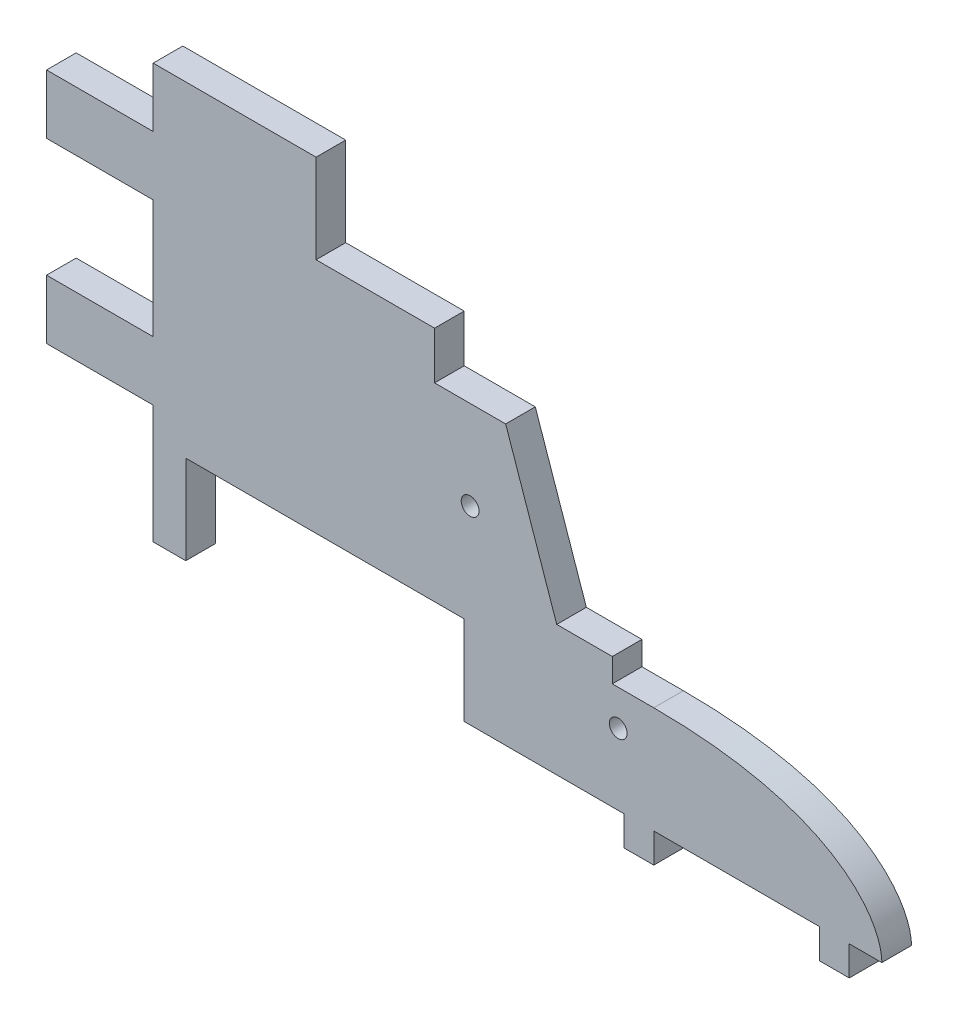
ISO-10303-21;
HEADER;
FILE_DESCRIPTION(('STEP AP214'),'2;1');
FILE_NAME('part.step','',(''),(''),'','','');
FILE_SCHEMA(('AUTOMOTIVE_DESIGN { 1 0 10303 214 1 1 1 1 }'));
ENDSEC;
DATA;
#1=APPLICATION_CONTEXT('core data for automotive mechanical design processes');
#2=APPLICATION_PROTOCOL_DEFINITION('international standard','automotive_design',2000,#1);
#3=PRODUCT_CONTEXT('',#1,'mechanical');
#4=PRODUCT('Part','Part','',(#3));
#5=PRODUCT_RELATED_PRODUCT_CATEGORY('part','',(#4));
#6=PRODUCT_DEFINITION_FORMATION('','',#4);
#7=PRODUCT_DEFINITION_CONTEXT('part definition',#1,'design');
#8=PRODUCT_DEFINITION('design','',#6,#7);
#9=PRODUCT_DEFINITION_SHAPE('','',#8);
#10=(LENGTH_UNIT() NAMED_UNIT(*) SI_UNIT(.MILLI.,.METRE.));
#11=(NAMED_UNIT(*) PLANE_ANGLE_UNIT() SI_UNIT($,.RADIAN.));
#12=(NAMED_UNIT(*) SI_UNIT($,.STERADIAN.) SOLID_ANGLE_UNIT());
#13=UNCERTAINTY_MEASURE_WITH_UNIT(LENGTH_MEASURE(1.E-05),#10,'distance_accuracy_value','');
#14=(GEOMETRIC_REPRESENTATION_CONTEXT(3) GLOBAL_UNCERTAINTY_ASSIGNED_CONTEXT((#13)) GLOBAL_UNIT_ASSIGNED_CONTEXT((#10,
#11,#12)) REPRESENTATION_CONTEXT('',''));
#15=CARTESIAN_POINT('',(0.,0.,0.));
#16=DIRECTION('',(0.,0.,1.));
#17=DIRECTION('',(1.,0.,0.));
#18=AXIS2_PLACEMENT_3D('',#15,#16,#17);
#19=CARTESIAN_POINT('',(0.,0.,5.));
#20=DIRECTION('',(0.,0.,-1.));
#21=DIRECTION('',(-1.,0.,0.));
#22=AXIS2_PLACEMENT_3D('',#19,#20,#21);
#23=PLANE('',#22);
#24=CARTESIAN_POINT('',(6.,32.,5.));
#25=DIRECTION('',(0.,0.,1.));
#26=DIRECTION('',(1.,0.,0.));
#27=AXIS2_PLACEMENT_3D('',#24,#25,#26);
#28=CIRCLE('',#27,1.5);
#29=CARTESIAN_POINT('',(7.5,32.,5.));
#30=VERTEX_POINT('',#29);
#31=EDGE_CURVE('E428',#30,#30,#28,.T.);
#32=ORIENTED_EDGE('',*,*,#31,.F.);
#33=EDGE_LOOP('',(#32));
#34=FACE_BOUND('',#33,.T.);
#35=DIRECTION('',(-1.,0.,0.));
#36=VECTOR('',#35,1.);
#37=CARTESIAN_POINT('',(0.,15.,5.));
#38=LINE('',#37,#36);
#39=CARTESIAN_POINT('',(5.,15.,5.));
#40=VERTEX_POINT('',#39);
#41=CARTESIAN_POINT('',(-42.,15.,5.));
#42=VERTEX_POINT('',#41);
#43=EDGE_CURVE('E304',#40,#42,#38,.T.);
#44=ORIENTED_EDGE('',*,*,#43,.F.);
#45=DIRECTION('',(0.,-1.,0.));
#46=VECTOR('',#45,1.);
#47=CARTESIAN_POINT('',(5.,0.,5.));
#48=LINE('',#47,#46);
#49=CARTESIAN_POINT('',(5.,0.,5.));
#50=VERTEX_POINT('',#49);
#51=EDGE_CURVE('E260',#40,#50,#48,.T.);
#52=ORIENTED_EDGE('',*,*,#51,.T.);
#53=DIRECTION('',(1.,0.,0.));
#54=VECTOR('',#53,1.);
#55=CARTESIAN_POINT('',(0.,0.,5.));
#56=LINE('',#55,#54);
#57=CARTESIAN_POINT('',(32.,0.,5.));
#58=VERTEX_POINT('',#57);
#59=EDGE_CURVE('E407',#50,#58,#56,.T.);
#60=ORIENTED_EDGE('',*,*,#59,.T.);
#61=DIRECTION('',(0.,-1.,0.));
#62=VECTOR('',#61,1.);
#63=CARTESIAN_POINT('',(32.,0.,5.));
#64=LINE('',#63,#62);
#65=CARTESIAN_POINT('',(32.,-5.,5.));
#66=VERTEX_POINT('',#65);
#67=EDGE_CURVE('E412',#58,#66,#64,.T.);
#68=ORIENTED_EDGE('',*,*,#67,.T.);
#69=DIRECTION('',(1.,0.,0.));
#70=VECTOR('',#69,1.);
#71=CARTESIAN_POINT('',(37.,-5.,5.));
#72=LINE('',#71,#70);
#73=CARTESIAN_POINT('',(37.,-5.,5.));
#74=VERTEX_POINT('',#73);
#75=EDGE_CURVE('E381',#66,#74,#72,.T.);
#76=ORIENTED_EDGE('',*,*,#75,.T.);
#77=DIRECTION('',(0.,1.,0.));
#78=VECTOR('',#77,1.);
#79=CARTESIAN_POINT('',(37.,0.,5.));
#80=LINE('',#79,#78);
#81=CARTESIAN_POINT('',(37.,0.,5.));
#82=VERTEX_POINT('',#81);
#83=EDGE_CURVE('E422',#74,#82,#80,.T.);
#84=ORIENTED_EDGE('',*,*,#83,.T.);
#85=DIRECTION('',(-1.,0.,0.));
#86=VECTOR('',#85,1.);
#87=CARTESIAN_POINT('',(37.,0.,5.));
#88=LINE('',#87,#86);
#89=CARTESIAN_POINT('',(65.,0.,5.));
#90=VERTEX_POINT('',#89);
#91=EDGE_CURVE('E443',#90,#82,#88,.T.);
#92=ORIENTED_EDGE('',*,*,#91,.F.);
#93=DIRECTION('',(0.,1.,0.));
#94=VECTOR('',#93,1.);
#95=CARTESIAN_POINT('',(65.,0.,5.));
#96=LINE('',#95,#94);
#97=CARTESIAN_POINT('',(65.,-4.99999999999995,5.));
#98=VERTEX_POINT('',#97);
#99=EDGE_CURVE('E475',#98,#90,#96,.T.);
#100=ORIENTED_EDGE('',*,*,#99,.F.);
#101=DIRECTION('',(-1.,0.,0.));
#102=VECTOR('',#101,1.);
#103=CARTESIAN_POINT('',(70.,-4.99999999999995,5.));
#104=LINE('',#103,#102);
#105=CARTESIAN_POINT('',(70.,-4.99999999999995,5.));
#106=VERTEX_POINT('',#105);
#107=EDGE_CURVE('E478',#106,#98,#104,.T.);
#108=ORIENTED_EDGE('',*,*,#107,.F.);
#109=DIRECTION('',(0.,-1.,0.));
#110=VECTOR('',#109,1.);
#111=CARTESIAN_POINT('',(70.,0.,5.));
#112=LINE('',#111,#110);
#113=CARTESIAN_POINT('',(70.,0.,5.));
#114=VERTEX_POINT('',#113);
#115=EDGE_CURVE('E480',#114,#106,#112,.T.);
#116=ORIENTED_EDGE('',*,*,#115,.F.);
#117=DIRECTION('',(-1.,0.,0.));
#118=VECTOR('',#117,1.);
#119=CARTESIAN_POINT('',(70.,0.,5.));
#120=LINE('',#119,#118);
#121=CARTESIAN_POINT('',(75.5,0.,5.));
#122=VERTEX_POINT('',#121);
#123=EDGE_CURVE('E313',#122,#114,#120,.T.);
#124=ORIENTED_EDGE('',*,*,#123,.F.);
#125=CARTESIAN_POINT('',(37.,18.,5.));
#126=CARTESIAN_POINT('',(67.6854096357002,18.,5.));
#127=CARTESIAN_POINT('',(75.5,5.98223252941199,5.));
#128=CARTESIAN_POINT('',(75.5,0.,5.));
#129=B_SPLINE_CURVE_WITH_KNOTS('',3,(#125,#126,#127,#128),.UNSPECIFIED.,.F.,.F.,(4,4),(0.,1.),.UNSPECIFIED.);
#130=CARTESIAN_POINT('',(37.,18.,5.));
#131=VERTEX_POINT('',#130);
#132=EDGE_CURVE('E307',#131,#122,#129,.T.);
#133=ORIENTED_EDGE('',*,*,#132,.F.);
#134=DIRECTION('',(-1.,0.,0.));
#135=VECTOR('',#134,1.);
#136=CARTESIAN_POINT('',(22.,18.,5.));
#137=LINE('',#136,#135);
#138=CARTESIAN_POINT('',(30.,18.,5.));
#139=VERTEX_POINT('',#138);
#140=EDGE_CURVE('E425',#131,#139,#137,.T.);
#141=ORIENTED_EDGE('',*,*,#140,.T.);
#142=DIRECTION('',(0.,-1.,0.));
#143=VECTOR('',#142,1.);
#144=CARTESIAN_POINT('',(30.,18.,5.));
#145=LINE('',#144,#143);
#146=CARTESIAN_POINT('',(30.,22.,5.));
#147=VERTEX_POINT('',#146);
#148=EDGE_CURVE('E271',#147,#139,#145,.T.);
#149=ORIENTED_EDGE('',*,*,#148,.F.);
#150=DIRECTION('',(1.,0.,0.));
#151=VECTOR('',#150,1.);
#152=CARTESIAN_POINT('',(30.,22.,5.));
#153=LINE('',#152,#151);
#154=CARTESIAN_POINT('',(20.6206896551724,22.,5.));
#155=VERTEX_POINT('',#154);
#156=EDGE_CURVE('E274',#155,#147,#153,.T.);
#157=ORIENTED_EDGE('',*,*,#156,.F.);
#158=DIRECTION('',(-0.325990683319404,0.945372981626272,0.));
#159=VECTOR('',#158,1.);
#160=CARTESIAN_POINT('',(12.,47.,5.));
#161=LINE('',#160,#159);
#162=CARTESIAN_POINT('',(12.,47.,5.));
#163=VERTEX_POINT('',#162);
#164=EDGE_CURVE('E427',#155,#163,#161,.T.);
#165=ORIENTED_EDGE('',*,*,#164,.T.);
#166=DIRECTION('',(-1.,0.,0.));
#167=VECTOR('',#166,1.);
#168=CARTESIAN_POINT('',(0.,47.,5.));
#169=LINE('',#168,#167);
#170=CARTESIAN_POINT('',(0.,47.,5.));
#171=VERTEX_POINT('',#170);
#172=EDGE_CURVE('E403',#163,#171,#169,.T.);
#173=ORIENTED_EDGE('',*,*,#172,.T.);
#174=DIRECTION('',(0.,-1.,0.));
#175=VECTOR('',#174,1.);
#176=CARTESIAN_POINT('',(0.,15.,5.));
#177=LINE('',#176,#175);
#178=CARTESIAN_POINT('',(0.,55.,5.));
#179=VERTEX_POINT('',#178);
#180=EDGE_CURVE('E296',#179,#171,#177,.T.);
#181=ORIENTED_EDGE('',*,*,#180,.F.);
#182=DIRECTION('',(1.,0.,0.));
#183=VECTOR('',#182,1.);
#184=CARTESIAN_POINT('',(0.,55.,5.));
#185=LINE('',#184,#183);
#186=CARTESIAN_POINT('',(-19.9999999999999,55.,5.));
#187=VERTEX_POINT('',#186);
#188=EDGE_CURVE('E292',#187,#179,#185,.T.);
#189=ORIENTED_EDGE('',*,*,#188,.F.);
#190=DIRECTION('',(0.,-1.,0.));
#191=VECTOR('',#190,1.);
#192=CARTESIAN_POINT('',(-19.9999999999999,55.,5.));
#193=LINE('',#192,#191);
#194=CARTESIAN_POINT('',(-19.9999999999999,70.,5.));
#195=VERTEX_POINT('',#194);
#196=EDGE_CURVE('E289',#195,#187,#193,.T.);
#197=ORIENTED_EDGE('',*,*,#196,.F.);
#198=DIRECTION('',(1.,0.,0.));
#199=VECTOR('',#198,1.);
#200=CARTESIAN_POINT('',(-19.9999999999999,70.,5.));
#201=LINE('',#200,#199);
#202=CARTESIAN_POINT('',(-47.5,70.,5.));
#203=VERTEX_POINT('',#202);
#204=EDGE_CURVE('E578',#203,#195,#201,.T.);
#205=ORIENTED_EDGE('',*,*,#204,.F.);
#206=DIRECTION('',(0.,1.,0.));
#207=VECTOR('',#206,1.);
#208=CARTESIAN_POINT('',(-47.5,70.,5.));
#209=LINE('',#208,#207);
#210=CARTESIAN_POINT('',(-47.5,60.,5.));
#211=VERTEX_POINT('',#210);
#212=EDGE_CURVE('E582',#211,#203,#209,.T.);
#213=ORIENTED_EDGE('',*,*,#212,.F.);
#214=DIRECTION('',(1.,0.,0.));
#215=VECTOR('',#214,1.);
#216=CARTESIAN_POINT('',(-47.5,60.,5.));
#217=LINE('',#216,#215);
#218=CARTESIAN_POINT('',(-65.5,60.,5.));
#219=VERTEX_POINT('',#218);
#220=EDGE_CURVE('E586',#219,#211,#217,.T.);
#221=ORIENTED_EDGE('',*,*,#220,.F.);
#222=DIRECTION('',(0.,1.,0.));
#223=VECTOR('',#222,1.);
#224=CARTESIAN_POINT('',(-65.5,60.,5.));
#225=LINE('',#224,#223);
#226=CARTESIAN_POINT('',(-65.5,50.,5.));
#227=VERTEX_POINT('',#226);
#228=EDGE_CURVE('E591',#227,#219,#225,.T.);
#229=ORIENTED_EDGE('',*,*,#228,.F.);
#230=DIRECTION('',(-1.,0.,0.));
#231=VECTOR('',#230,1.);
#232=CARTESIAN_POINT('',(-47.5,50.,5.));
#233=LINE('',#232,#231);
#234=CARTESIAN_POINT('',(-47.5,50.,5.));
#235=VERTEX_POINT('',#234);
#236=EDGE_CURVE('E594',#235,#227,#233,.T.);
#237=ORIENTED_EDGE('',*,*,#236,.F.);
#238=DIRECTION('',(0.,1.,0.));
#239=VECTOR('',#238,1.);
#240=CARTESIAN_POINT('',(-47.5,50.,5.));
#241=LINE('',#240,#239);
#242=CARTESIAN_POINT('',(-47.5,30.,5.));
#243=VERTEX_POINT('',#242);
#244=EDGE_CURVE('E597',#243,#235,#241,.T.);
#245=ORIENTED_EDGE('',*,*,#244,.F.);
#246=DIRECTION('',(1.,0.,0.));
#247=VECTOR('',#246,1.);
#248=CARTESIAN_POINT('',(-47.5,30.,5.));
#249=LINE('',#248,#247);
#250=CARTESIAN_POINT('',(-65.5,30.,5.));
#251=VERTEX_POINT('',#250);
#252=EDGE_CURVE('E600',#251,#243,#249,.T.);
#253=ORIENTED_EDGE('',*,*,#252,.F.);
#254=DIRECTION('',(0.,1.,0.));
#255=VECTOR('',#254,1.);
#256=CARTESIAN_POINT('',(-65.5,20.,5.));
#257=LINE('',#256,#255);
#258=CARTESIAN_POINT('',(-65.5,20.,5.));
#259=VERTEX_POINT('',#258);
#260=EDGE_CURVE('E603',#259,#251,#257,.T.);
#261=ORIENTED_EDGE('',*,*,#260,.F.);
#262=DIRECTION('',(-1.,0.,0.));
#263=VECTOR('',#262,1.);
#264=CARTESIAN_POINT('',(-47.5,20.,5.));
#265=LINE('',#264,#263);
#266=CARTESIAN_POINT('',(-47.5,20.,5.));
#267=VERTEX_POINT('',#266);
#268=EDGE_CURVE('E606',#267,#259,#265,.T.);
#269=ORIENTED_EDGE('',*,*,#268,.F.);
#270=DIRECTION('',(0.,1.,0.));
#271=VECTOR('',#270,1.);
#272=CARTESIAN_POINT('',(-47.5,20.,5.));
#273=LINE('',#272,#271);
#274=CARTESIAN_POINT('',(-47.5,0.,5.));
#275=VERTEX_POINT('',#274);
#276=EDGE_CURVE('E609',#275,#267,#273,.T.);
#277=ORIENTED_EDGE('',*,*,#276,.F.);
#278=DIRECTION('',(-1.,0.,0.));
#279=VECTOR('',#278,1.);
#280=CARTESIAN_POINT('',(-42.,0.,5.));
#281=LINE('',#280,#279);
#282=CARTESIAN_POINT('',(-42.,0.,5.));
#283=VERTEX_POINT('',#282);
#284=EDGE_CURVE('E611',#283,#275,#281,.T.);
#285=ORIENTED_EDGE('',*,*,#284,.F.);
#286=DIRECTION('',(0.,-1.,0.));
#287=VECTOR('',#286,1.);
#288=CARTESIAN_POINT('',(-42.,15.,5.));
#289=LINE('',#288,#287);
#290=EDGE_CURVE('E299',#42,#283,#289,.T.);
#291=ORIENTED_EDGE('',*,*,#290,.F.);
#292=EDGE_LOOP('',(#44,#52,#60,#68,#76,#84,#92,#100,#108,#116,#124,#133,#141,#149,#157,#165,
#173,#181,#189,#197,#205,#213,#221,#229,#237,#245,#253,#261,#269,#277,#285,#291));
#293=FACE_BOUND('',#292,.T.);
#294=CARTESIAN_POINT('',(31.,12.,5.));
#295=DIRECTION('',(0.,0.,1.));
#296=DIRECTION('',(1.,0.,0.));
#297=AXIS2_PLACEMENT_3D('',#294,#295,#296);
#298=CIRCLE('',#297,1.5);
#299=CARTESIAN_POINT('',(32.5,12.,5.));
#300=VERTEX_POINT('',#299);
#301=EDGE_CURVE('E432',#300,#300,#298,.T.);
#302=ORIENTED_EDGE('',*,*,#301,.F.);
#303=EDGE_LOOP('',(#302));
#304=FACE_BOUND('',#303,.T.);
#305=ADVANCED_FACE('F33',(#34,#293,#304),#23,.F.);
#306=CARTESIAN_POINT('',(0.,0.,0.));
#307=DIRECTION('',(0.,0.,-1.));
#308=DIRECTION('',(-1.,0.,0.));
#309=AXIS2_PLACEMENT_3D('',#306,#307,#308);
#310=PLANE('',#309);
#311=DIRECTION('',(0.,-1.,0.));
#312=VECTOR('',#311,1.);
#313=CARTESIAN_POINT('',(5.,15.,0.));
#314=LINE('',#313,#312);
#315=CARTESIAN_POINT('',(5.,15.,0.));
#316=VERTEX_POINT('',#315);
#317=CARTESIAN_POINT('',(5.,0.,0.));
#318=VERTEX_POINT('',#317);
#319=EDGE_CURVE('E258',#316,#318,#314,.T.);
#320=ORIENTED_EDGE('',*,*,#319,.F.);
#321=DIRECTION('',(-1.,0.,0.));
#322=VECTOR('',#321,1.);
#323=CARTESIAN_POINT('',(0.,15.,0.));
#324=LINE('',#323,#322);
#325=CARTESIAN_POINT('',(-42.,15.,0.));
#326=VERTEX_POINT('',#325);
#327=EDGE_CURVE('E242',#316,#326,#324,.T.);
#328=ORIENTED_EDGE('',*,*,#327,.T.);
#329=DIRECTION('',(0.,-1.,0.));
#330=VECTOR('',#329,1.);
#331=CARTESIAN_POINT('',(-42.,15.,0.));
#332=LINE('',#331,#330);
#333=CARTESIAN_POINT('',(-42.,0.,0.));
#334=VERTEX_POINT('',#333);
#335=EDGE_CURVE('E252',#326,#334,#332,.T.);
#336=ORIENTED_EDGE('',*,*,#335,.T.);
#337=DIRECTION('',(-1.,0.,0.));
#338=VECTOR('',#337,1.);
#339=CARTESIAN_POINT('',(-42.,0.,0.));
#340=LINE('',#339,#338);
#341=CARTESIAN_POINT('',(-47.5,0.,0.));
#342=VERTEX_POINT('',#341);
#343=EDGE_CURVE('E520',#334,#342,#340,.T.);
#344=ORIENTED_EDGE('',*,*,#343,.T.);
#345=DIRECTION('',(0.,1.,0.));
#346=VECTOR('',#345,1.);
#347=CARTESIAN_POINT('',(-47.5,20.,0.));
#348=LINE('',#347,#346);
#349=CARTESIAN_POINT('',(-47.5,20.,0.));
#350=VERTEX_POINT('',#349);
#351=EDGE_CURVE('E523',#342,#350,#348,.T.);
#352=ORIENTED_EDGE('',*,*,#351,.T.);
#353=DIRECTION('',(-1.,0.,0.));
#354=VECTOR('',#353,1.);
#355=CARTESIAN_POINT('',(-47.5,20.,0.));
#356=LINE('',#355,#354);
#357=CARTESIAN_POINT('',(-65.5,20.,0.));
#358=VERTEX_POINT('',#357);
#359=EDGE_CURVE('E526',#350,#358,#356,.T.);
#360=ORIENTED_EDGE('',*,*,#359,.T.);
#361=DIRECTION('',(0.,1.,0.));
#362=VECTOR('',#361,1.);
#363=CARTESIAN_POINT('',(-65.5,20.,0.));
#364=LINE('',#363,#362);
#365=CARTESIAN_POINT('',(-65.5,30.,0.));
#366=VERTEX_POINT('',#365);
#367=EDGE_CURVE('E529',#358,#366,#364,.T.);
#368=ORIENTED_EDGE('',*,*,#367,.T.);
#369=DIRECTION('',(1.,0.,0.));
#370=VECTOR('',#369,1.);
#371=CARTESIAN_POINT('',(-47.5,30.,0.));
#372=LINE('',#371,#370);
#373=CARTESIAN_POINT('',(-47.5,30.,0.));
#374=VERTEX_POINT('',#373);
#375=EDGE_CURVE('E532',#366,#374,#372,.T.);
#376=ORIENTED_EDGE('',*,*,#375,.T.);
#377=DIRECTION('',(0.,1.,0.));
#378=VECTOR('',#377,1.);
#379=CARTESIAN_POINT('',(-47.5,50.,0.));
#380=LINE('',#379,#378);
#381=CARTESIAN_POINT('',(-47.5,50.,0.));
#382=VERTEX_POINT('',#381);
#383=EDGE_CURVE('E535',#374,#382,#380,.T.);
#384=ORIENTED_EDGE('',*,*,#383,.T.);
#385=DIRECTION('',(-1.,0.,0.));
#386=VECTOR('',#385,1.);
#387=CARTESIAN_POINT('',(-47.5,50.,0.));
#388=LINE('',#387,#386);
#389=CARTESIAN_POINT('',(-65.5,50.,0.));
#390=VERTEX_POINT('',#389);
#391=EDGE_CURVE('E538',#382,#390,#388,.T.);
#392=ORIENTED_EDGE('',*,*,#391,.T.);
#393=DIRECTION('',(0.,1.,0.));
#394=VECTOR('',#393,1.);
#395=CARTESIAN_POINT('',(-65.5,60.,0.));
#396=LINE('',#395,#394);
#397=CARTESIAN_POINT('',(-65.5,60.,0.));
#398=VERTEX_POINT('',#397);
#399=EDGE_CURVE('E541',#390,#398,#396,.T.);
#400=ORIENTED_EDGE('',*,*,#399,.T.);
#401=DIRECTION('',(1.,0.,0.));
#402=VECTOR('',#401,1.);
#403=CARTESIAN_POINT('',(-47.5,60.,0.));
#404=LINE('',#403,#402);
#405=CARTESIAN_POINT('',(-47.5,60.,0.));
#406=VERTEX_POINT('',#405);
#407=EDGE_CURVE('E544',#398,#406,#404,.T.);
#408=ORIENTED_EDGE('',*,*,#407,.T.);
#409=DIRECTION('',(0.,1.,0.));
#410=VECTOR('',#409,1.);
#411=CARTESIAN_POINT('',(-47.5,70.,0.));
#412=LINE('',#411,#410);
#413=CARTESIAN_POINT('',(-47.5,70.,0.));
#414=VERTEX_POINT('',#413);
#415=EDGE_CURVE('E547',#406,#414,#412,.T.);
#416=ORIENTED_EDGE('',*,*,#415,.T.);
#417=DIRECTION('',(1.,0.,0.));
#418=VECTOR('',#417,1.);
#419=CARTESIAN_POINT('',(-19.9999999999999,70.,0.));
#420=LINE('',#419,#418);
#421=CARTESIAN_POINT('',(-19.9999999999999,70.,0.));
#422=VERTEX_POINT('',#421);
#423=EDGE_CURVE('E293',#414,#422,#420,.T.);
#424=ORIENTED_EDGE('',*,*,#423,.T.);
#425=DIRECTION('',(0.,-1.,0.));
#426=VECTOR('',#425,1.);
#427=CARTESIAN_POINT('',(-19.9999999999999,55.,0.));
#428=LINE('',#427,#426);
#429=CARTESIAN_POINT('',(-19.9999999999999,55.,0.));
#430=VERTEX_POINT('',#429);
#431=EDGE_CURVE('E284',#422,#430,#428,.T.);
#432=ORIENTED_EDGE('',*,*,#431,.T.);
#433=DIRECTION('',(1.,0.,0.));
#434=VECTOR('',#433,1.);
#435=CARTESIAN_POINT('',(0.,55.,0.));
#436=LINE('',#435,#434);
#437=CARTESIAN_POINT('',(0.,55.,0.));
#438=VERTEX_POINT('',#437);
#439=EDGE_CURVE('E513',#430,#438,#436,.T.);
#440=ORIENTED_EDGE('',*,*,#439,.T.);
#441=DIRECTION('',(0.,-1.,0.));
#442=VECTOR('',#441,1.);
#443=CARTESIAN_POINT('',(0.,15.,0.));
#444=LINE('',#443,#442);
#445=CARTESIAN_POINT('',(0.,47.,0.));
#446=VERTEX_POINT('',#445);
#447=EDGE_CURVE('E253',#438,#446,#444,.T.);
#448=ORIENTED_EDGE('',*,*,#447,.T.);
#449=DIRECTION('',(-1.,0.,0.));
#450=VECTOR('',#449,1.);
#451=CARTESIAN_POINT('',(0.,47.,0.));
#452=LINE('',#451,#450);
#453=CARTESIAN_POINT('',(12.,47.,0.));
#454=VERTEX_POINT('',#453);
#455=EDGE_CURVE('E394',#454,#446,#452,.T.);
#456=ORIENTED_EDGE('',*,*,#455,.F.);
#457=DIRECTION('',(-0.325990683319404,0.945372981626272,0.));
#458=VECTOR('',#457,1.);
#459=CARTESIAN_POINT('',(12.,47.,0.));
#460=LINE('',#459,#458);
#461=CARTESIAN_POINT('',(20.6206896551724,22.,0.));
#462=VERTEX_POINT('',#461);
#463=EDGE_CURVE('E392',#462,#454,#460,.T.);
#464=ORIENTED_EDGE('',*,*,#463,.F.);
#465=DIRECTION('',(1.,0.,0.));
#466=VECTOR('',#465,1.);
#467=CARTESIAN_POINT('',(30.,22.,0.));
#468=LINE('',#467,#466);
#469=CARTESIAN_POINT('',(30.,22.,0.));
#470=VERTEX_POINT('',#469);
#471=EDGE_CURVE('E275',#462,#470,#468,.T.);
#472=ORIENTED_EDGE('',*,*,#471,.T.);
#473=DIRECTION('',(0.,-1.,0.));
#474=VECTOR('',#473,1.);
#475=CARTESIAN_POINT('',(30.,18.,0.));
#476=LINE('',#475,#474);
#477=CARTESIAN_POINT('',(30.,18.,0.));
#478=VERTEX_POINT('',#477);
#479=EDGE_CURVE('E270',#470,#478,#476,.T.);
#480=ORIENTED_EDGE('',*,*,#479,.T.);
#481=DIRECTION('',(-1.,0.,0.));
#482=VECTOR('',#481,1.);
#483=CARTESIAN_POINT('',(22.,18.,0.));
#484=LINE('',#483,#482);
#485=CARTESIAN_POINT('',(37.,18.,0.));
#486=VERTEX_POINT('',#485);
#487=EDGE_CURVE('E53',#486,#478,#484,.T.);
#488=ORIENTED_EDGE('',*,*,#487,.F.);
#489=CARTESIAN_POINT('',(37.,18.,0.));
#490=CARTESIAN_POINT('',(67.6854096357002,18.,0.));
#491=CARTESIAN_POINT('',(75.5,5.98223252941199,0.));
#492=CARTESIAN_POINT('',(75.5,0.,0.));
#493=B_SPLINE_CURVE_WITH_KNOTS('',3,(#489,#490,#491,#492),.UNSPECIFIED.,.F.,.F.,(4,4),(0.,1.),.UNSPECIFIED.);
#494=CARTESIAN_POINT('',(75.5,0.,0.));
#495=VERTEX_POINT('',#494);
#496=EDGE_CURVE('E465',#486,#495,#493,.T.);
#497=ORIENTED_EDGE('',*,*,#496,.T.);
#498=DIRECTION('',(-1.,0.,0.));
#499=VECTOR('',#498,1.);
#500=CARTESIAN_POINT('',(70.,0.,0.));
#501=LINE('',#500,#499);
#502=CARTESIAN_POINT('',(70.,0.,0.));
#503=VERTEX_POINT('',#502);
#504=EDGE_CURVE('E462',#495,#503,#501,.T.);
#505=ORIENTED_EDGE('',*,*,#504,.T.);
#506=DIRECTION('',(0.,-1.,0.));
#507=VECTOR('',#506,1.);
#508=CARTESIAN_POINT('',(70.,0.,0.));
#509=LINE('',#508,#507);
#510=CARTESIAN_POINT('',(70.,-4.99999999999995,0.));
#511=VERTEX_POINT('',#510);
#512=EDGE_CURVE('E459',#503,#511,#509,.T.);
#513=ORIENTED_EDGE('',*,*,#512,.T.);
#514=DIRECTION('',(-1.,0.,0.));
#515=VECTOR('',#514,1.);
#516=CARTESIAN_POINT('',(70.,-4.99999999999995,0.));
#517=LINE('',#516,#515);
#518=CARTESIAN_POINT('',(65.,-4.99999999999995,0.));
#519=VERTEX_POINT('',#518);
#520=EDGE_CURVE('E456',#511,#519,#517,.T.);
#521=ORIENTED_EDGE('',*,*,#520,.T.);
#522=DIRECTION('',(0.,1.,0.));
#523=VECTOR('',#522,1.);
#524=CARTESIAN_POINT('',(65.,0.,0.));
#525=LINE('',#524,#523);
#526=CARTESIAN_POINT('',(65.,0.,0.));
#527=VERTEX_POINT('',#526);
#528=EDGE_CURVE('E453',#519,#527,#525,.T.);
#529=ORIENTED_EDGE('',*,*,#528,.T.);
#530=DIRECTION('',(-1.,0.,0.));
#531=VECTOR('',#530,1.);
#532=CARTESIAN_POINT('',(37.,0.,0.));
#533=LINE('',#532,#531);
#534=CARTESIAN_POINT('',(37.,0.,0.));
#535=VERTEX_POINT('',#534);
#536=EDGE_CURVE('E314',#527,#535,#533,.T.);
#537=ORIENTED_EDGE('',*,*,#536,.T.);
#538=DIRECTION('',(0.,1.,0.));
#539=VECTOR('',#538,1.);
#540=CARTESIAN_POINT('',(37.,0.,0.));
#541=LINE('',#540,#539);
#542=CARTESIAN_POINT('',(37.,-5.,0.));
#543=VERTEX_POINT('',#542);
#544=EDGE_CURVE('E386',#543,#535,#541,.T.);
#545=ORIENTED_EDGE('',*,*,#544,.F.);
#546=DIRECTION('',(1.,0.,0.));
#547=VECTOR('',#546,1.);
#548=CARTESIAN_POINT('',(37.,-5.,0.));
#549=LINE('',#548,#547);
#550=CARTESIAN_POINT('',(32.,-5.,0.));
#551=VERTEX_POINT('',#550);
#552=EDGE_CURVE('E376',#551,#543,#549,.T.);
#553=ORIENTED_EDGE('',*,*,#552,.F.);
#554=DIRECTION('',(0.,-1.,0.));
#555=VECTOR('',#554,1.);
#556=CARTESIAN_POINT('',(32.,0.,0.));
#557=LINE('',#556,#555);
#558=CARTESIAN_POINT('',(32.,0.,0.));
#559=VERTEX_POINT('',#558);
#560=EDGE_CURVE('E369',#559,#551,#557,.T.);
#561=ORIENTED_EDGE('',*,*,#560,.F.);
#562=DIRECTION('',(1.,0.,0.));
#563=VECTOR('',#562,1.);
#564=CARTESIAN_POINT('',(0.,0.,0.));
#565=LINE('',#564,#563);
#566=EDGE_CURVE('E266',#318,#559,#565,.T.);
#567=ORIENTED_EDGE('',*,*,#566,.F.);
#568=EDGE_LOOP('',(#320,#328,#336,#344,#352,#360,#368,#376,#384,#392,#400,#408,#416,#424,#432,
#440,#448,#456,#464,#472,#480,#488,#497,#505,#513,#521,#529,#537,#545,#553,#561,#567));
#569=FACE_BOUND('',#568,.T.);
#570=CARTESIAN_POINT('',(6.,32.,0.));
#571=DIRECTION('',(0.,0.,1.));
#572=DIRECTION('',(1.,0.,0.));
#573=AXIS2_PLACEMENT_3D('',#570,#571,#572);
#574=CIRCLE('',#573,1.5);
#575=CARTESIAN_POINT('',(7.5,32.,0.));
#576=VERTEX_POINT('',#575);
#577=EDGE_CURVE('E418',#576,#576,#574,.T.);
#578=ORIENTED_EDGE('',*,*,#577,.T.);
#579=EDGE_LOOP('',(#578));
#580=FACE_BOUND('',#579,.T.);
#581=CARTESIAN_POINT('',(31.,12.,0.));
#582=DIRECTION('',(0.,0.,1.));
#583=DIRECTION('',(1.,0.,0.));
#584=AXIS2_PLACEMENT_3D('',#581,#582,#583);
#585=CIRCLE('',#584,1.5);
#586=CARTESIAN_POINT('',(32.5,12.,0.));
#587=VERTEX_POINT('',#586);
#588=EDGE_CURVE('E434',#587,#587,#585,.T.);
#589=ORIENTED_EDGE('',*,*,#588,.T.);
#590=EDGE_LOOP('',(#589));
#591=FACE_BOUND('',#590,.T.);
#592=ADVANCED_FACE('F263',(#569,#580,#591),#310,.T.);
#593=CARTESIAN_POINT('',(0.,0.,5.));
#594=DIRECTION('',(0.,1.,0.));
#595=DIRECTION('',(-1.,0.,0.));
#596=AXIS2_PLACEMENT_3D('',#593,#594,#595);
#597=PLANE('',#596);
#598=ORIENTED_EDGE('',*,*,#59,.F.);
#599=DIRECTION('',(0.,0.,-1.));
#600=VECTOR('',#599,1.);
#601=CARTESIAN_POINT('',(5.,0.,5.));
#602=LINE('',#601,#600);
#603=EDGE_CURVE('E11',#50,#318,#602,.T.);
#604=ORIENTED_EDGE('',*,*,#603,.T.);
#605=ORIENTED_EDGE('',*,*,#566,.T.);
#606=DIRECTION('',(0.,0.,-1.));
#607=VECTOR('',#606,1.);
#608=CARTESIAN_POINT('',(32.,0.,5.));
#609=LINE('',#608,#607);
#610=EDGE_CURVE('E41',#58,#559,#609,.T.);
#611=ORIENTED_EDGE('',*,*,#610,.F.);
#612=EDGE_LOOP('',(#598,#604,#605,#611));
#613=FACE_BOUND('',#612,.T.);
#614=ADVANCED_FACE('F35',(#613),#597,.F.);
#615=CARTESIAN_POINT('',(32.,0.,5.));
#616=DIRECTION('',(1.,0.,0.));
#617=DIRECTION('',(0.,0.,-1.));
#618=AXIS2_PLACEMENT_3D('',#615,#616,#617);
#619=PLANE('',#618);
#620=ORIENTED_EDGE('',*,*,#560,.T.);
#621=DIRECTION('',(0.,0.,-1.));
#622=VECTOR('',#621,1.);
#623=CARTESIAN_POINT('',(32.,-5.,5.));
#624=LINE('',#623,#622);
#625=EDGE_CURVE('E372',#66,#551,#624,.T.);
#626=ORIENTED_EDGE('',*,*,#625,.F.);
#627=ORIENTED_EDGE('',*,*,#67,.F.);
#628=ORIENTED_EDGE('',*,*,#610,.T.);
#629=EDGE_LOOP('',(#620,#626,#627,#628));
#630=FACE_BOUND('',#629,.T.);
#631=ADVANCED_FACE('F359',(#630),#619,.F.);
#632=CARTESIAN_POINT('',(37.,-5.,5.));
#633=DIRECTION('',(0.,1.,0.));
#634=DIRECTION('',(-1.,0.,0.));
#635=AXIS2_PLACEMENT_3D('',#632,#633,#634);
#636=PLANE('',#635);
#637=ORIENTED_EDGE('',*,*,#552,.T.);
#638=DIRECTION('',(0.,0.,-1.));
#639=VECTOR('',#638,1.);
#640=CARTESIAN_POINT('',(37.,-5.,5.));
#641=LINE('',#640,#639);
#642=EDGE_CURVE('E382',#74,#543,#641,.T.);
#643=ORIENTED_EDGE('',*,*,#642,.F.);
#644=ORIENTED_EDGE('',*,*,#75,.F.);
#645=ORIENTED_EDGE('',*,*,#625,.T.);
#646=EDGE_LOOP('',(#637,#643,#644,#645));
#647=FACE_BOUND('',#646,.T.);
#648=ADVANCED_FACE('F356',(#647),#636,.F.);
#649=CARTESIAN_POINT('',(37.,0.,5.));
#650=DIRECTION('',(-1.,0.,0.));
#651=DIRECTION('',(0.,0.,1.));
#652=AXIS2_PLACEMENT_3D('',#649,#650,#651);
#653=PLANE('',#652);
#654=ORIENTED_EDGE('',*,*,#544,.T.);
#655=DIRECTION('',(0.,0.,-1.));
#656=VECTOR('',#655,1.);
#657=CARTESIAN_POINT('',(37.,0.,5.));
#658=LINE('',#657,#656);
#659=EDGE_CURVE('E437',#82,#535,#658,.T.);
#660=ORIENTED_EDGE('',*,*,#659,.F.);
#661=ORIENTED_EDGE('',*,*,#83,.F.);
#662=ORIENTED_EDGE('',*,*,#642,.T.);
#663=EDGE_LOOP('',(#654,#660,#661,#662));
#664=FACE_BOUND('',#663,.T.);
#665=ADVANCED_FACE('F353',(#664),#653,.F.);
#666=CARTESIAN_POINT('',(22.,18.,5.));
#667=DIRECTION('',(0.,-1.,0.));
#668=DIRECTION('',(1.,0.,0.));
#669=AXIS2_PLACEMENT_3D('',#666,#667,#668);
#670=PLANE('',#669);
#671=ORIENTED_EDGE('',*,*,#487,.T.);
#672=DIRECTION('',(0.,0.,-1.));
#673=VECTOR('',#672,1.);
#674=CARTESIAN_POINT('',(30.,18.,5.));
#675=LINE('',#674,#673);
#676=EDGE_CURVE('E48',#139,#478,#675,.T.);
#677=ORIENTED_EDGE('',*,*,#676,.F.);
#678=ORIENTED_EDGE('',*,*,#140,.F.);
#679=DIRECTION('',(0.,0.,-1.));
#680=VECTOR('',#679,1.);
#681=CARTESIAN_POINT('',(37.,18.,5.));
#682=LINE('',#681,#680);
#683=EDGE_CURVE('E492',#131,#486,#682,.T.);
#684=ORIENTED_EDGE('',*,*,#683,.T.);
#685=EDGE_LOOP('',(#671,#677,#678,#684));
#686=FACE_BOUND('',#685,.T.);
#687=ADVANCED_FACE('F349',(#686),#670,.F.);
#688=CARTESIAN_POINT('',(12.,47.,5.));
#689=DIRECTION('',(-0.945372981626272,-0.325990683319404,0.));
#690=DIRECTION('',(0.325990683319404,-0.945372981626272,0.));
#691=AXIS2_PLACEMENT_3D('',#688,#689,#690);
#692=PLANE('',#691);
#693=ORIENTED_EDGE('',*,*,#164,.F.);
#694=DIRECTION('',(0.,0.,-1.));
#695=VECTOR('',#694,1.);
#696=CARTESIAN_POINT('',(20.6206896551724,22.,5.));
#697=LINE('',#696,#695);
#698=EDGE_CURVE('E285',#155,#462,#697,.T.);
#699=ORIENTED_EDGE('',*,*,#698,.T.);
#700=ORIENTED_EDGE('',*,*,#463,.T.);
#701=DIRECTION('',(0.,0.,-1.));
#702=VECTOR('',#701,1.);
#703=CARTESIAN_POINT('',(12.,47.,5.));
#704=LINE('',#703,#702);
#705=EDGE_CURVE('E397',#163,#454,#704,.T.);
#706=ORIENTED_EDGE('',*,*,#705,.F.);
#707=EDGE_LOOP('',(#693,#699,#700,#706));
#708=FACE_BOUND('',#707,.T.);
#709=ADVANCED_FACE('F345',(#708),#692,.F.);
#710=CARTESIAN_POINT('',(0.,47.,5.));
#711=DIRECTION('',(0.,-1.,0.));
#712=DIRECTION('',(0.,0.,-1.));
#713=AXIS2_PLACEMENT_3D('',#710,#711,#712);
#714=PLANE('',#713);
#715=ORIENTED_EDGE('',*,*,#455,.T.);
#716=DIRECTION('',(0.,0.,-1.));
#717=VECTOR('',#716,1.);
#718=CARTESIAN_POINT('',(0.,47.,5.));
#719=LINE('',#718,#717);
#720=EDGE_CURVE('E400',#171,#446,#719,.T.);
#721=ORIENTED_EDGE('',*,*,#720,.F.);
#722=ORIENTED_EDGE('',*,*,#172,.F.);
#723=ORIENTED_EDGE('',*,*,#705,.T.);
#724=EDGE_LOOP('',(#715,#721,#722,#723));
#725=FACE_BOUND('',#724,.T.);
#726=ADVANCED_FACE('F336',(#725),#714,.F.);
#727=CARTESIAN_POINT('',(6.,32.,5.));
#728=DIRECTION('',(0.,0.,-1.));
#729=DIRECTION('',(-1.,0.,0.));
#730=AXIS2_PLACEMENT_3D('',#727,#728,#729);
#731=CYLINDRICAL_SURFACE('',#730,1.5);
#732=ORIENTED_EDGE('',*,*,#31,.T.);
#733=EDGE_LOOP('',(#732));
#734=FACE_BOUND('',#733,.T.);
#735=ORIENTED_EDGE('',*,*,#577,.F.);
#736=EDGE_LOOP('',(#735));
#737=FACE_BOUND('',#736,.T.);
#738=ADVANCED_FACE('F332',(#734,#737),#731,.F.);
#739=CARTESIAN_POINT('',(31.,12.,5.));
#740=DIRECTION('',(0.,0.,-1.));
#741=DIRECTION('',(-1.,0.,0.));
#742=AXIS2_PLACEMENT_3D('',#739,#740,#741);
#743=CYLINDRICAL_SURFACE('',#742,1.5);
#744=ORIENTED_EDGE('',*,*,#301,.T.);
#745=EDGE_LOOP('',(#744));
#746=FACE_BOUND('',#745,.T.);
#747=ORIENTED_EDGE('',*,*,#588,.F.);
#748=EDGE_LOOP('',(#747));
#749=FACE_BOUND('',#748,.T.);
#750=ADVANCED_FACE('F328',(#746,#749),#743,.F.);
#751=CARTESIAN_POINT('',(37.,0.,5.));
#752=DIRECTION('',(0.,-1.,0.));
#753=DIRECTION('',(1.,0.,0.));
#754=AXIS2_PLACEMENT_3D('',#751,#752,#753);
#755=PLANE('',#754);
#756=ORIENTED_EDGE('',*,*,#536,.F.);
#757=DIRECTION('',(0.,0.,-1.));
#758=VECTOR('',#757,1.);
#759=CARTESIAN_POINT('',(65.,0.,5.));
#760=LINE('',#759,#758);
#761=EDGE_CURVE('E449',#90,#527,#760,.T.);
#762=ORIENTED_EDGE('',*,*,#761,.F.);
#763=ORIENTED_EDGE('',*,*,#91,.T.);
#764=ORIENTED_EDGE('',*,*,#659,.T.);
#765=EDGE_LOOP('',(#756,#762,#763,#764));
#766=FACE_BOUND('',#765,.T.);
#767=ADVANCED_FACE('F331',(#766),#755,.T.);
#768=CARTESIAN_POINT('',(65.,0.,5.));
#769=DIRECTION('',(-1.,0.,0.));
#770=DIRECTION('',(0.,0.,1.));
#771=AXIS2_PLACEMENT_3D('',#768,#769,#770);
#772=PLANE('',#771);
#773=ORIENTED_EDGE('',*,*,#528,.F.);
#774=DIRECTION('',(0.,0.,-1.));
#775=VECTOR('',#774,1.);
#776=CARTESIAN_POINT('',(65.,-4.99999999999995,5.));
#777=LINE('',#776,#775);
#778=EDGE_CURVE('E447',#98,#519,#777,.T.);
#779=ORIENTED_EDGE('',*,*,#778,.F.);
#780=ORIENTED_EDGE('',*,*,#99,.T.);
#781=ORIENTED_EDGE('',*,*,#761,.T.);
#782=EDGE_LOOP('',(#773,#779,#780,#781));
#783=FACE_BOUND('',#782,.T.);
#784=ADVANCED_FACE('F679',(#783),#772,.T.);
#785=CARTESIAN_POINT('',(70.,-4.99999999999995,5.));
#786=DIRECTION('',(0.,-1.,0.));
#787=DIRECTION('',(1.,0.,0.));
#788=AXIS2_PLACEMENT_3D('',#785,#786,#787);
#789=PLANE('',#788);
#790=ORIENTED_EDGE('',*,*,#520,.F.);
#791=DIRECTION('',(0.,0.,-1.));
#792=VECTOR('',#791,1.);
#793=CARTESIAN_POINT('',(70.,-4.99999999999995,5.));
#794=LINE('',#793,#792);
#795=EDGE_CURVE('E445',#106,#511,#794,.T.);
#796=ORIENTED_EDGE('',*,*,#795,.F.);
#797=ORIENTED_EDGE('',*,*,#107,.T.);
#798=ORIENTED_EDGE('',*,*,#778,.T.);
#799=EDGE_LOOP('',(#790,#796,#797,#798));
#800=FACE_BOUND('',#799,.T.);
#801=ADVANCED_FACE('F683',(#800),#789,.T.);
#802=CARTESIAN_POINT('',(70.,0.,5.));
#803=DIRECTION('',(1.,0.,0.));
#804=DIRECTION('',(0.,0.,-1.));
#805=AXIS2_PLACEMENT_3D('',#802,#803,#804);
#806=PLANE('',#805);
#807=ORIENTED_EDGE('',*,*,#512,.F.);
#808=DIRECTION('',(0.,0.,-1.));
#809=VECTOR('',#808,1.);
#810=CARTESIAN_POINT('',(70.,0.,5.));
#811=LINE('',#810,#809);
#812=EDGE_CURVE('E442',#114,#503,#811,.T.);
#813=ORIENTED_EDGE('',*,*,#812,.F.);
#814=ORIENTED_EDGE('',*,*,#115,.T.);
#815=ORIENTED_EDGE('',*,*,#795,.T.);
#816=EDGE_LOOP('',(#807,#813,#814,#815));
#817=FACE_BOUND('',#816,.T.);
#818=ADVANCED_FACE('F686',(#817),#806,.T.);
#819=CARTESIAN_POINT('',(70.,0.,5.));
#820=DIRECTION('',(0.,-1.,0.));
#821=DIRECTION('',(1.,0.,0.));
#822=AXIS2_PLACEMENT_3D('',#819,#820,#821);
#823=PLANE('',#822);
#824=ORIENTED_EDGE('',*,*,#504,.F.);
#825=DIRECTION('',(0.,0.,-1.));
#826=VECTOR('',#825,1.);
#827=CARTESIAN_POINT('',(75.5,0.,5.));
#828=LINE('',#827,#826);
#829=EDGE_CURVE('E440',#122,#495,#828,.T.);
#830=ORIENTED_EDGE('',*,*,#829,.F.);
#831=ORIENTED_EDGE('',*,*,#123,.T.);
#832=ORIENTED_EDGE('',*,*,#812,.T.);
#833=EDGE_LOOP('',(#824,#830,#831,#832));
#834=FACE_BOUND('',#833,.T.);
#835=ADVANCED_FACE('F325',(#834),#823,.T.);
#836=DIRECTION('',(0.,0.,-1.));
#837=VECTOR('',#836,1.);
#838=SURFACE_OF_LINEAR_EXTRUSION('',#129,#837);
#839=ORIENTED_EDGE('',*,*,#496,.F.);
#840=ORIENTED_EDGE('',*,*,#683,.F.);
#841=ORIENTED_EDGE('',*,*,#132,.T.);
#842=ORIENTED_EDGE('',*,*,#829,.T.);
#843=EDGE_LOOP('',(#839,#840,#841,#842));
#844=FACE_BOUND('',#843,.T.);
#845=ADVANCED_FACE('F320',(#844),#838,.T.);
#846=CARTESIAN_POINT('',(-19.9999999999999,55.,5.));
#847=DIRECTION('',(1.,0.,0.));
#848=DIRECTION('',(0.,1.,0.));
#849=AXIS2_PLACEMENT_3D('',#846,#847,#848);
#850=PLANE('',#849);
#851=ORIENTED_EDGE('',*,*,#431,.F.);
#852=DIRECTION('',(0.,0.,-1.));
#853=VECTOR('',#852,1.);
#854=CARTESIAN_POINT('',(-19.9999999999999,70.,5.));
#855=LINE('',#854,#853);
#856=EDGE_CURVE('E470',#195,#422,#855,.T.);
#857=ORIENTED_EDGE('',*,*,#856,.F.);
#858=ORIENTED_EDGE('',*,*,#196,.T.);
#859=DIRECTION('',(0.,0.,-1.));
#860=VECTOR('',#859,1.);
#861=CARTESIAN_POINT('',(-19.9999999999999,55.,5.));
#862=LINE('',#861,#860);
#863=EDGE_CURVE('E577',#187,#430,#862,.T.);
#864=ORIENTED_EDGE('',*,*,#863,.T.);
#865=EDGE_LOOP('',(#851,#857,#858,#864));
#866=FACE_BOUND('',#865,.T.);
#867=ADVANCED_FACE('F324',(#866),#850,.T.);
#868=CARTESIAN_POINT('',(-19.9999999999999,70.,5.));
#869=DIRECTION('',(0.,1.,0.));
#870=DIRECTION('',(0.,0.,1.));
#871=AXIS2_PLACEMENT_3D('',#868,#869,#870);
#872=PLANE('',#871);
#873=ORIENTED_EDGE('',*,*,#423,.F.);
#874=DIRECTION('',(0.,0.,-1.));
#875=VECTOR('',#874,1.);
#876=CARTESIAN_POINT('',(-47.5,70.,5.));
#877=LINE('',#876,#875);
#878=EDGE_CURVE('E553',#203,#414,#877,.T.);
#879=ORIENTED_EDGE('',*,*,#878,.F.);
#880=ORIENTED_EDGE('',*,*,#204,.T.);
#881=ORIENTED_EDGE('',*,*,#856,.T.);
#882=EDGE_LOOP('',(#873,#879,#880,#881));
#883=FACE_BOUND('',#882,.T.);
#884=ADVANCED_FACE('F658',(#883),#872,.T.);
#885=CARTESIAN_POINT('',(-47.5,70.,5.));
#886=DIRECTION('',(-1.,0.,0.));
#887=DIRECTION('',(0.,0.,1.));
#888=AXIS2_PLACEMENT_3D('',#885,#886,#887);
#889=PLANE('',#888);
#890=ORIENTED_EDGE('',*,*,#415,.F.);
#891=DIRECTION('',(0.,0.,-1.));
#892=VECTOR('',#891,1.);
#893=CARTESIAN_POINT('',(-47.5,60.,5.));
#894=LINE('',#893,#892);
#895=EDGE_CURVE('E555',#211,#406,#894,.T.);
#896=ORIENTED_EDGE('',*,*,#895,.F.);
#897=ORIENTED_EDGE('',*,*,#212,.T.);
#898=ORIENTED_EDGE('',*,*,#878,.T.);
#899=EDGE_LOOP('',(#890,#896,#897,#898));
#900=FACE_BOUND('',#899,.T.);
#901=ADVANCED_FACE('F657',(#900),#889,.T.);
#902=CARTESIAN_POINT('',(-47.5,60.,5.));
#903=DIRECTION('',(0.,1.,0.));
#904=DIRECTION('',(0.,0.,1.));
#905=AXIS2_PLACEMENT_3D('',#902,#903,#904);
#906=PLANE('',#905);
#907=ORIENTED_EDGE('',*,*,#407,.F.);
#908=DIRECTION('',(0.,0.,-1.));
#909=VECTOR('',#908,1.);
#910=CARTESIAN_POINT('',(-65.5,60.,5.));
#911=LINE('',#910,#909);
#912=EDGE_CURVE('E557',#219,#398,#911,.T.);
#913=ORIENTED_EDGE('',*,*,#912,.F.);
#914=ORIENTED_EDGE('',*,*,#220,.T.);
#915=ORIENTED_EDGE('',*,*,#895,.T.);
#916=EDGE_LOOP('',(#907,#913,#914,#915));
#917=FACE_BOUND('',#916,.T.);
#918=ADVANCED_FACE('F653',(#917),#906,.T.);
#919=CARTESIAN_POINT('',(-65.5,60.,5.));
#920=DIRECTION('',(-1.,0.,0.));
#921=DIRECTION('',(0.,-1.,0.));
#922=AXIS2_PLACEMENT_3D('',#919,#920,#921);
#923=PLANE('',#922);
#924=ORIENTED_EDGE('',*,*,#399,.F.);
#925=DIRECTION('',(0.,0.,-1.));
#926=VECTOR('',#925,1.);
#927=CARTESIAN_POINT('',(-65.5,50.,5.));
#928=LINE('',#927,#926);
#929=EDGE_CURVE('E559',#227,#390,#928,.T.);
#930=ORIENTED_EDGE('',*,*,#929,.F.);
#931=ORIENTED_EDGE('',*,*,#228,.T.);
#932=ORIENTED_EDGE('',*,*,#912,.T.);
#933=EDGE_LOOP('',(#924,#930,#931,#932));
#934=FACE_BOUND('',#933,.T.);
#935=ADVANCED_FACE('F648',(#934),#923,.T.);
#936=CARTESIAN_POINT('',(-47.5,50.,5.));
#937=DIRECTION('',(0.,-1.,0.));
#938=DIRECTION('',(0.,0.,-1.));
#939=AXIS2_PLACEMENT_3D('',#936,#937,#938);
#940=PLANE('',#939);
#941=ORIENTED_EDGE('',*,*,#391,.F.);
#942=DIRECTION('',(0.,0.,-1.));
#943=VECTOR('',#942,1.);
#944=CARTESIAN_POINT('',(-47.5,50.,5.));
#945=LINE('',#944,#943);
#946=EDGE_CURVE('E561',#235,#382,#945,.T.);
#947=ORIENTED_EDGE('',*,*,#946,.F.);
#948=ORIENTED_EDGE('',*,*,#236,.T.);
#949=ORIENTED_EDGE('',*,*,#929,.T.);
#950=EDGE_LOOP('',(#941,#947,#948,#949));
#951=FACE_BOUND('',#950,.T.);
#952=ADVANCED_FACE('F644',(#951),#940,.T.);
#953=CARTESIAN_POINT('',(-47.5,50.,5.));
#954=DIRECTION('',(-1.,0.,0.));
#955=DIRECTION('',(0.,-1.,0.));
#956=AXIS2_PLACEMENT_3D('',#953,#954,#955);
#957=PLANE('',#956);
#958=ORIENTED_EDGE('',*,*,#383,.F.);
#959=DIRECTION('',(0.,0.,-1.));
#960=VECTOR('',#959,1.);
#961=CARTESIAN_POINT('',(-47.5,30.,5.));
#962=LINE('',#961,#960);
#963=EDGE_CURVE('E563',#243,#374,#962,.T.);
#964=ORIENTED_EDGE('',*,*,#963,.F.);
#965=ORIENTED_EDGE('',*,*,#244,.T.);
#966=ORIENTED_EDGE('',*,*,#946,.T.);
#967=EDGE_LOOP('',(#958,#964,#965,#966));
#968=FACE_BOUND('',#967,.T.);
#969=ADVANCED_FACE('F640',(#968),#957,.T.);
#970=CARTESIAN_POINT('',(-47.5,30.,5.));
#971=DIRECTION('',(0.,1.,0.));
#972=DIRECTION('',(0.,0.,1.));
#973=AXIS2_PLACEMENT_3D('',#970,#971,#972);
#974=PLANE('',#973);
#975=ORIENTED_EDGE('',*,*,#375,.F.);
#976=DIRECTION('',(0.,0.,-1.));
#977=VECTOR('',#976,1.);
#978=CARTESIAN_POINT('',(-65.5,30.,5.));
#979=LINE('',#978,#977);
#980=EDGE_CURVE('E565',#251,#366,#979,.T.);
#981=ORIENTED_EDGE('',*,*,#980,.F.);
#982=ORIENTED_EDGE('',*,*,#252,.T.);
#983=ORIENTED_EDGE('',*,*,#963,.T.);
#984=EDGE_LOOP('',(#975,#981,#982,#983));
#985=FACE_BOUND('',#984,.T.);
#986=ADVANCED_FACE('F636',(#985),#974,.T.);
#987=CARTESIAN_POINT('',(-65.5,20.,5.));
#988=DIRECTION('',(-1.,0.,0.));
#989=DIRECTION('',(0.,0.,1.));
#990=AXIS2_PLACEMENT_3D('',#987,#988,#989);
#991=PLANE('',#990);
#992=ORIENTED_EDGE('',*,*,#367,.F.);
#993=DIRECTION('',(0.,0.,-1.));
#994=VECTOR('',#993,1.);
#995=CARTESIAN_POINT('',(-65.5,20.,5.));
#996=LINE('',#995,#994);
#997=EDGE_CURVE('E567',#259,#358,#996,.T.);
#998=ORIENTED_EDGE('',*,*,#997,.F.);
#999=ORIENTED_EDGE('',*,*,#260,.T.);
#1000=ORIENTED_EDGE('',*,*,#980,.T.);
#1001=EDGE_LOOP('',(#992,#998,#999,#1000));
#1002=FACE_BOUND('',#1001,.T.);
#1003=ADVANCED_FACE('F632',(#1002),#991,.T.);
#1004=CARTESIAN_POINT('',(-47.5,20.,5.));
#1005=DIRECTION('',(0.,-1.,0.));
#1006=DIRECTION('',(1.,0.,0.));
#1007=AXIS2_PLACEMENT_3D('',#1004,#1005,#1006);
#1008=PLANE('',#1007);
#1009=ORIENTED_EDGE('',*,*,#359,.F.);
#1010=DIRECTION('',(0.,0.,-1.));
#1011=VECTOR('',#1010,1.);
#1012=CARTESIAN_POINT('',(-47.5,20.,5.));
#1013=LINE('',#1012,#1011);
#1014=EDGE_CURVE('E569',#267,#350,#1013,.T.);
#1015=ORIENTED_EDGE('',*,*,#1014,.F.);
#1016=ORIENTED_EDGE('',*,*,#268,.T.);
#1017=ORIENTED_EDGE('',*,*,#997,.T.);
#1018=EDGE_LOOP('',(#1009,#1015,#1016,#1017));
#1019=FACE_BOUND('',#1018,.T.);
#1020=ADVANCED_FACE('F630',(#1019),#1008,.T.);
#1021=CARTESIAN_POINT('',(-47.5,20.,5.));
#1022=DIRECTION('',(-1.,0.,0.));
#1023=DIRECTION('',(0.,0.,1.));
#1024=AXIS2_PLACEMENT_3D('',#1021,#1022,#1023);
#1025=PLANE('',#1024);
#1026=ORIENTED_EDGE('',*,*,#351,.F.);
#1027=DIRECTION('',(0.,0.,-1.));
#1028=VECTOR('',#1027,1.);
#1029=CARTESIAN_POINT('',(-47.5,0.,5.));
#1030=LINE('',#1029,#1028);
#1031=EDGE_CURVE('E571',#275,#342,#1030,.T.);
#1032=ORIENTED_EDGE('',*,*,#1031,.F.);
#1033=ORIENTED_EDGE('',*,*,#276,.T.);
#1034=ORIENTED_EDGE('',*,*,#1014,.T.);
#1035=EDGE_LOOP('',(#1026,#1032,#1033,#1034));
#1036=FACE_BOUND('',#1035,.T.);
#1037=ADVANCED_FACE('F625',(#1036),#1025,.T.);
#1038=CARTESIAN_POINT('',(-42.,0.,5.));
#1039=DIRECTION('',(0.,-1.,0.));
#1040=DIRECTION('',(0.,0.,-1.));
#1041=AXIS2_PLACEMENT_3D('',#1038,#1039,#1040);
#1042=PLANE('',#1041);
#1043=ORIENTED_EDGE('',*,*,#343,.F.);
#1044=DIRECTION('',(0.,0.,-1.));
#1045=VECTOR('',#1044,1.);
#1046=CARTESIAN_POINT('',(-42.,0.,5.));
#1047=LINE('',#1046,#1045);
#1048=EDGE_CURVE('E573',#283,#334,#1047,.T.);
#1049=ORIENTED_EDGE('',*,*,#1048,.F.);
#1050=ORIENTED_EDGE('',*,*,#284,.T.);
#1051=ORIENTED_EDGE('',*,*,#1031,.T.);
#1052=EDGE_LOOP('',(#1043,#1049,#1050,#1051));
#1053=FACE_BOUND('',#1052,.T.);
#1054=ADVANCED_FACE('F627',(#1053),#1042,.T.);
#1055=CARTESIAN_POINT('',(-42.,15.,5.));
#1056=DIRECTION('',(1.,0.,0.));
#1057=DIRECTION('',(0.,1.,0.));
#1058=AXIS2_PLACEMENT_3D('',#1055,#1056,#1057);
#1059=PLANE('',#1058);
#1060=ORIENTED_EDGE('',*,*,#335,.F.);
#1061=DIRECTION('',(0.,0.,-1.));
#1062=VECTOR('',#1061,1.);
#1063=CARTESIAN_POINT('',(-42.,15.,5.));
#1064=LINE('',#1063,#1062);
#1065=EDGE_CURVE('E247',#42,#326,#1064,.T.);
#1066=ORIENTED_EDGE('',*,*,#1065,.F.);
#1067=ORIENTED_EDGE('',*,*,#290,.T.);
#1068=ORIENTED_EDGE('',*,*,#1048,.T.);
#1069=EDGE_LOOP('',(#1060,#1066,#1067,#1068));
#1070=FACE_BOUND('',#1069,.T.);
#1071=ADVANCED_FACE('F618',(#1070),#1059,.T.);
#1072=CARTESIAN_POINT('',(0.,15.,5.));
#1073=DIRECTION('',(0.,-1.,0.));
#1074=DIRECTION('',(0.,0.,-1.));
#1075=AXIS2_PLACEMENT_3D('',#1072,#1073,#1074);
#1076=PLANE('',#1075);
#1077=ORIENTED_EDGE('',*,*,#327,.F.);
#1078=DIRECTION('',(0.,0.,-1.));
#1079=VECTOR('',#1078,1.);
#1080=CARTESIAN_POINT('',(5.,15.,10.));
#1081=LINE('',#1080,#1079);
#1082=EDGE_CURVE('E246',#40,#316,#1081,.T.);
#1083=ORIENTED_EDGE('',*,*,#1082,.F.);
#1084=ORIENTED_EDGE('',*,*,#43,.T.);
#1085=ORIENTED_EDGE('',*,*,#1065,.T.);
#1086=EDGE_LOOP('',(#1077,#1083,#1084,#1085));
#1087=FACE_BOUND('',#1086,.T.);
#1088=ADVANCED_FACE('F244',(#1087),#1076,.T.);
#1089=CARTESIAN_POINT('',(0.,15.,5.));
#1090=DIRECTION('',(1.,0.,0.));
#1091=DIRECTION('',(0.,1.,0.));
#1092=AXIS2_PLACEMENT_3D('',#1089,#1090,#1091);
#1093=PLANE('',#1092);
#1094=ORIENTED_EDGE('',*,*,#180,.T.);
#1095=ORIENTED_EDGE('',*,*,#720,.T.);
#1096=ORIENTED_EDGE('',*,*,#447,.F.);
#1097=DIRECTION('',(0.,0.,-1.));
#1098=VECTOR('',#1097,1.);
#1099=CARTESIAN_POINT('',(0.,55.,5.));
#1100=LINE('',#1099,#1098);
#1101=EDGE_CURVE('E576',#179,#438,#1100,.T.);
#1102=ORIENTED_EDGE('',*,*,#1101,.F.);
#1103=EDGE_LOOP('',(#1094,#1095,#1096,#1102));
#1104=FACE_BOUND('',#1103,.T.);
#1105=ADVANCED_FACE('F509',(#1104),#1093,.T.);
#1106=CARTESIAN_POINT('',(0.,55.,5.));
#1107=DIRECTION('',(0.,1.,0.));
#1108=DIRECTION('',(0.,0.,1.));
#1109=AXIS2_PLACEMENT_3D('',#1106,#1107,#1108);
#1110=PLANE('',#1109);
#1111=ORIENTED_EDGE('',*,*,#439,.F.);
#1112=ORIENTED_EDGE('',*,*,#863,.F.);
#1113=ORIENTED_EDGE('',*,*,#188,.T.);
#1114=ORIENTED_EDGE('',*,*,#1101,.T.);
#1115=EDGE_LOOP('',(#1111,#1112,#1113,#1114));
#1116=FACE_BOUND('',#1115,.T.);
#1117=ADVANCED_FACE('F661',(#1116),#1110,.T.);
#1118=CARTESIAN_POINT('',(30.,18.,5.));
#1119=DIRECTION('',(1.,0.,0.));
#1120=DIRECTION('',(0.,1.,0.));
#1121=AXIS2_PLACEMENT_3D('',#1118,#1119,#1120);
#1122=PLANE('',#1121);
#1123=ORIENTED_EDGE('',*,*,#479,.F.);
#1124=DIRECTION('',(0.,0.,-1.));
#1125=VECTOR('',#1124,1.);
#1126=CARTESIAN_POINT('',(30.,22.,5.));
#1127=LINE('',#1126,#1125);
#1128=EDGE_CURVE('E282',#147,#470,#1127,.T.);
#1129=ORIENTED_EDGE('',*,*,#1128,.F.);
#1130=ORIENTED_EDGE('',*,*,#148,.T.);
#1131=ORIENTED_EDGE('',*,*,#676,.T.);
#1132=EDGE_LOOP('',(#1123,#1129,#1130,#1131));
#1133=FACE_BOUND('',#1132,.T.);
#1134=ADVANCED_FACE('F663',(#1133),#1122,.T.);
#1135=CARTESIAN_POINT('',(30.,22.,5.));
#1136=DIRECTION('',(0.,1.,0.));
#1137=DIRECTION('',(0.,0.,1.));
#1138=AXIS2_PLACEMENT_3D('',#1135,#1136,#1137);
#1139=PLANE('',#1138);
#1140=ORIENTED_EDGE('',*,*,#471,.F.);
#1141=ORIENTED_EDGE('',*,*,#698,.F.);
#1142=ORIENTED_EDGE('',*,*,#156,.T.);
#1143=ORIENTED_EDGE('',*,*,#1128,.T.);
#1144=EDGE_LOOP('',(#1140,#1141,#1142,#1143));
#1145=FACE_BOUND('',#1144,.T.);
#1146=ADVANCED_FACE('F669',(#1145),#1139,.T.);
#1147=CARTESIAN_POINT('',(5.,15.,10.));
#1148=DIRECTION('',(1.,0.,0.));
#1149=DIRECTION('',(0.,1.,0.));
#1150=AXIS2_PLACEMENT_3D('',#1147,#1148,#1149);
#1151=PLANE('',#1150);
#1152=ORIENTED_EDGE('',*,*,#1082,.T.);
#1153=ORIENTED_EDGE('',*,*,#319,.T.);
#1154=ORIENTED_EDGE('',*,*,#603,.F.);
#1155=ORIENTED_EDGE('',*,*,#51,.F.);
#1156=EDGE_LOOP('',(#1152,#1153,#1154,#1155));
#1157=FACE_BOUND('',#1156,.T.);
#1158=ADVANCED_FACE('F257',(#1157),#1151,.F.);
#1159=CLOSED_SHELL('',(#305,#592,#614,#631,#648,#665,#687,#709,#726,#738,#750,#767,#784,#801,
#818,#835,#845,#867,#884,#901,#918,#935,#952,#969,#986,#1003,#1020,#1037,#1054,#1071,#1088,
#1105,#1117,#1134,#1146,#1158));
#1160=MANIFOLD_SOLID_BREP('B2',#1159);
#1161=ADVANCED_BREP_SHAPE_REPRESENTATION('',(#18,#1160),#14);
#1162=SHAPE_DEFINITION_REPRESENTATION(#9,#1161);
ENDSEC;
END-ISO-10303-21;
